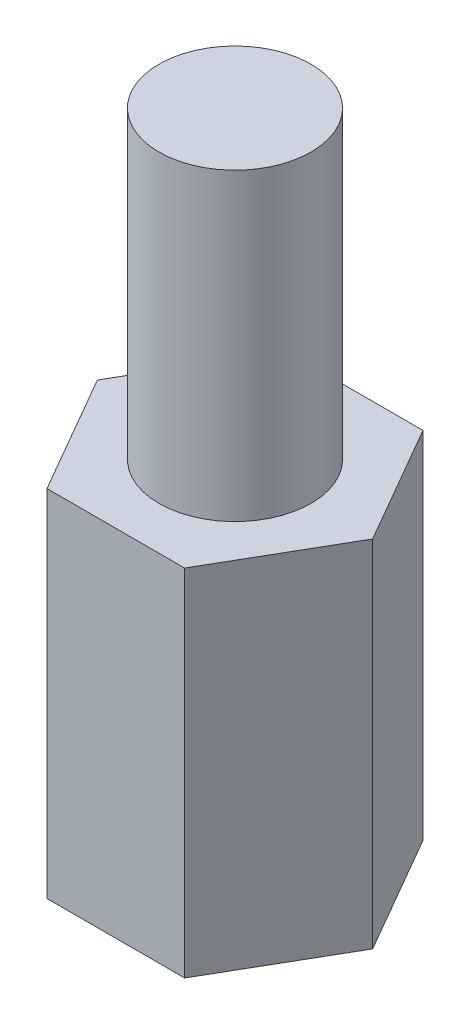
ISO-10303-21;
HEADER;
FILE_DESCRIPTION(('STEP AP214'),'2;1');
FILE_NAME('part.step','',(''),(''),'','','');
FILE_SCHEMA(('AUTOMOTIVE_DESIGN { 1 0 10303 214 1 1 1 1 }'));
ENDSEC;
DATA;
#1=APPLICATION_CONTEXT('core data for automotive mechanical design processes');
#2=APPLICATION_PROTOCOL_DEFINITION('international standard','automotive_design',2000,#1);
#3=PRODUCT_CONTEXT('',#1,'mechanical');
#4=PRODUCT('Part','Part','',(#3));
#5=PRODUCT_RELATED_PRODUCT_CATEGORY('part','',(#4));
#6=PRODUCT_DEFINITION_FORMATION('','',#4);
#7=PRODUCT_DEFINITION_CONTEXT('part definition',#1,'design');
#8=PRODUCT_DEFINITION('design','',#6,#7);
#9=PRODUCT_DEFINITION_SHAPE('','',#8);
#10=(LENGTH_UNIT() NAMED_UNIT(*) SI_UNIT(.MILLI.,.METRE.));
#11=(NAMED_UNIT(*) PLANE_ANGLE_UNIT() SI_UNIT($,.RADIAN.));
#12=(NAMED_UNIT(*) SI_UNIT($,.STERADIAN.) SOLID_ANGLE_UNIT());
#13=UNCERTAINTY_MEASURE_WITH_UNIT(LENGTH_MEASURE(1.E-05),#10,'distance_accuracy_value','');
#14=(GEOMETRIC_REPRESENTATION_CONTEXT(3) GLOBAL_UNCERTAINTY_ASSIGNED_CONTEXT((#13)) GLOBAL_UNIT_ASSIGNED_CONTEXT((#10,
#11,#12)) REPRESENTATION_CONTEXT('',''));
#15=CARTESIAN_POINT('',(0.,0.,0.));
#16=DIRECTION('',(0.,0.,1.));
#17=DIRECTION('',(1.,0.,0.));
#18=AXIS2_PLACEMENT_3D('',#15,#16,#17);
#19=CARTESIAN_POINT('',(0.,-7.,0.));
#20=DIRECTION('',(0.,1.,0.));
#21=DIRECTION('',(0.,0.,1.));
#22=AXIS2_PLACEMENT_3D('',#19,#20,#21);
#23=CYLINDRICAL_SURFACE('',#22,1.5);
#24=CARTESIAN_POINT('',(0.,-7.,0.));
#25=DIRECTION('',(0.,1.,0.));
#26=DIRECTION('',(0.,0.,1.));
#27=AXIS2_PLACEMENT_3D('',#24,#25,#26);
#28=CIRCLE('',#27,1.5);
#29=CARTESIAN_POINT('',(0.,-7.,1.5));
#30=VERTEX_POINT('',#29);
#31=EDGE_CURVE('E129',#30,#30,#28,.T.);
#32=ORIENTED_EDGE('',*,*,#31,.F.);
#33=EDGE_LOOP('',(#32));
#34=FACE_BOUND('',#33,.T.);
#35=CARTESIAN_POINT('',(0.,-1.,0.));
#36=DIRECTION('',(0.,1.,0.));
#37=DIRECTION('',(0.,0.,1.));
#38=AXIS2_PLACEMENT_3D('',#35,#36,#37);
#39=CIRCLE('',#38,1.5);
#40=CARTESIAN_POINT('',(0.,-1.,1.5));
#41=VERTEX_POINT('',#40);
#42=EDGE_CURVE('E11',#41,#41,#39,.F.);
#43=ORIENTED_EDGE('',*,*,#42,.F.);
#44=EDGE_LOOP('',(#43));
#45=FACE_BOUND('',#44,.T.);
#46=ADVANCED_FACE('F38',(#34,#45),#23,.F.);
#47=CARTESIAN_POINT('',(1.35677313259562,-7.,2.35));
#48=DIRECTION('',(0.866025403784439,0.,0.5));
#49=DIRECTION('',(0.5,0.,-0.866025403784439));
#50=AXIS2_PLACEMENT_3D('',#47,#48,#49);
#51=PLANE('',#50);
#52=DIRECTION('',(0.5,0.,-0.866025403784439));
#53=VECTOR('',#52,1.);
#54=CARTESIAN_POINT('',(1.35677313259562,0.,2.35));
#55=LINE('',#54,#53);
#56=CARTESIAN_POINT('',(1.35677313259562,0.,2.35));
#57=VERTEX_POINT('',#56);
#58=CARTESIAN_POINT('',(2.71354626519124,0.,0.));
#59=VERTEX_POINT('',#58);
#60=EDGE_CURVE('E125',#57,#59,#55,.T.);
#61=ORIENTED_EDGE('',*,*,#60,.F.);
#62=DIRECTION('',(0.,1.,0.));
#63=VECTOR('',#62,1.);
#64=CARTESIAN_POINT('',(1.35677313259562,-7.,2.35));
#65=LINE('',#64,#63);
#66=CARTESIAN_POINT('',(1.35677313259562,-7.,2.35));
#67=VERTEX_POINT('',#66);
#68=EDGE_CURVE('E47',#67,#57,#65,.T.);
#69=ORIENTED_EDGE('',*,*,#68,.F.);
#70=DIRECTION('',(0.5,0.,-0.866025403784439));
#71=VECTOR('',#70,1.);
#72=CARTESIAN_POINT('',(1.35677313259562,-7.,2.35));
#73=LINE('',#72,#71);
#74=CARTESIAN_POINT('',(2.71354626519124,-7.,0.));
#75=VERTEX_POINT('',#74);
#76=EDGE_CURVE('E141',#67,#75,#73,.T.);
#77=ORIENTED_EDGE('',*,*,#76,.T.);
#78=DIRECTION('',(0.,1.,0.));
#79=VECTOR('',#78,1.);
#80=CARTESIAN_POINT('',(2.71354626519124,-7.,0.));
#81=LINE('',#80,#79);
#82=EDGE_CURVE('E89',#75,#59,#81,.T.);
#83=ORIENTED_EDGE('',*,*,#82,.T.);
#84=EDGE_LOOP('',(#61,#69,#77,#83));
#85=FACE_BOUND('',#84,.T.);
#86=ADVANCED_FACE('F40',(#85),#51,.T.);
#87=CARTESIAN_POINT('',(-1.35677313259562,-7.,2.35));
#88=DIRECTION('',(0.,0.,1.));
#89=DIRECTION('',(1.,0.,0.));
#90=AXIS2_PLACEMENT_3D('',#87,#88,#89);
#91=PLANE('',#90);
#92=DIRECTION('',(1.,0.,0.));
#93=VECTOR('',#92,1.);
#94=CARTESIAN_POINT('',(-1.35677313259562,0.,2.35));
#95=LINE('',#94,#93);
#96=CARTESIAN_POINT('',(-1.35677313259562,0.,2.35));
#97=VERTEX_POINT('',#96);
#98=EDGE_CURVE('E138',#97,#57,#95,.T.);
#99=ORIENTED_EDGE('',*,*,#98,.F.);
#100=DIRECTION('',(0.,1.,0.));
#101=VECTOR('',#100,1.);
#102=CARTESIAN_POINT('',(-1.35677313259562,-7.,2.35));
#103=LINE('',#102,#101);
#104=CARTESIAN_POINT('',(-1.35677313259562,-7.,2.35));
#105=VERTEX_POINT('',#104);
#106=EDGE_CURVE('E77',#105,#97,#103,.T.);
#107=ORIENTED_EDGE('',*,*,#106,.F.);
#108=DIRECTION('',(1.,0.,0.));
#109=VECTOR('',#108,1.);
#110=CARTESIAN_POINT('',(-1.35677313259562,-7.,2.35));
#111=LINE('',#110,#109);
#112=EDGE_CURVE('E115',#105,#67,#111,.T.);
#113=ORIENTED_EDGE('',*,*,#112,.T.);
#114=ORIENTED_EDGE('',*,*,#68,.T.);
#115=EDGE_LOOP('',(#99,#107,#113,#114));
#116=FACE_BOUND('',#115,.T.);
#117=ADVANCED_FACE('F150',(#116),#91,.T.);
#118=CARTESIAN_POINT('',(-2.71354626519124,-7.,0.));
#119=DIRECTION('',(-0.866025403784438,0.,0.5));
#120=DIRECTION('',(0.5,0.,0.866025403784439));
#121=AXIS2_PLACEMENT_3D('',#118,#119,#120);
#122=PLANE('',#121);
#123=DIRECTION('',(0.5,0.,0.866025403784438));
#124=VECTOR('',#123,1.);
#125=CARTESIAN_POINT('',(-2.71354626519124,0.,0.));
#126=LINE('',#125,#124);
#127=CARTESIAN_POINT('',(-2.71354626519124,0.,0.));
#128=VERTEX_POINT('',#127);
#129=EDGE_CURVE('E102',#128,#97,#126,.T.);
#130=ORIENTED_EDGE('',*,*,#129,.F.);
#131=DIRECTION('',(0.,1.,0.));
#132=VECTOR('',#131,1.);
#133=CARTESIAN_POINT('',(-2.71354626519124,-7.,0.));
#134=LINE('',#133,#132);
#135=CARTESIAN_POINT('',(-2.71354626519124,-7.,0.));
#136=VERTEX_POINT('',#135);
#137=EDGE_CURVE('E97',#136,#128,#134,.T.);
#138=ORIENTED_EDGE('',*,*,#137,.F.);
#139=DIRECTION('',(0.5,0.,0.866025403784438));
#140=VECTOR('',#139,1.);
#141=CARTESIAN_POINT('',(-2.71354626519124,-7.,0.));
#142=LINE('',#141,#140);
#143=EDGE_CURVE('E100',#136,#105,#142,.T.);
#144=ORIENTED_EDGE('',*,*,#143,.T.);
#145=ORIENTED_EDGE('',*,*,#106,.T.);
#146=EDGE_LOOP('',(#130,#138,#144,#145));
#147=FACE_BOUND('',#146,.T.);
#148=ADVANCED_FACE('F99',(#147),#122,.T.);
#149=CARTESIAN_POINT('',(-1.35677313259562,-7.,-2.35));
#150=DIRECTION('',(-0.866025403784439,0.,-0.5));
#151=DIRECTION('',(-0.5,0.,0.866025403784439));
#152=AXIS2_PLACEMENT_3D('',#149,#150,#151);
#153=PLANE('',#152);
#154=DIRECTION('',(-0.5,0.,0.866025403784439));
#155=VECTOR('',#154,1.);
#156=CARTESIAN_POINT('',(-1.35677313259562,0.,-2.35));
#157=LINE('',#156,#155);
#158=CARTESIAN_POINT('',(-1.35677313259562,0.,-2.35));
#159=VERTEX_POINT('',#158);
#160=EDGE_CURVE('E135',#159,#128,#157,.T.);
#161=ORIENTED_EDGE('',*,*,#160,.F.);
#162=DIRECTION('',(0.,1.,0.));
#163=VECTOR('',#162,1.);
#164=CARTESIAN_POINT('',(-1.35677313259562,-7.,-2.35));
#165=LINE('',#164,#163);
#166=CARTESIAN_POINT('',(-1.35677313259562,-7.,-2.35));
#167=VERTEX_POINT('',#166);
#168=EDGE_CURVE('E107',#167,#159,#165,.T.);
#169=ORIENTED_EDGE('',*,*,#168,.F.);
#170=DIRECTION('',(-0.5,0.,0.866025403784439));
#171=VECTOR('',#170,1.);
#172=CARTESIAN_POINT('',(-1.35677313259562,-7.,-2.35));
#173=LINE('',#172,#171);
#174=EDGE_CURVE('E113',#167,#136,#173,.T.);
#175=ORIENTED_EDGE('',*,*,#174,.T.);
#176=ORIENTED_EDGE('',*,*,#137,.T.);
#177=EDGE_LOOP('',(#161,#169,#175,#176));
#178=FACE_BOUND('',#177,.T.);
#179=ADVANCED_FACE('F117',(#178),#153,.T.);
#180=CARTESIAN_POINT('',(1.35677313259562,-7.,-2.35));
#181=DIRECTION('',(0.,0.,-1.));
#182=DIRECTION('',(-1.,0.,0.));
#183=AXIS2_PLACEMENT_3D('',#180,#181,#182);
#184=PLANE('',#183);
#185=DIRECTION('',(-1.,0.,0.));
#186=VECTOR('',#185,1.);
#187=CARTESIAN_POINT('',(1.35677313259562,0.,-2.35));
#188=LINE('',#187,#186);
#189=CARTESIAN_POINT('',(1.35677313259562,0.,-2.35));
#190=VERTEX_POINT('',#189);
#191=EDGE_CURVE('E132',#190,#159,#188,.T.);
#192=ORIENTED_EDGE('',*,*,#191,.F.);
#193=DIRECTION('',(0.,1.,0.));
#194=VECTOR('',#193,1.);
#195=CARTESIAN_POINT('',(1.35677313259562,-7.,-2.35));
#196=LINE('',#195,#194);
#197=CARTESIAN_POINT('',(1.35677313259562,-7.,-2.35));
#198=VERTEX_POINT('',#197);
#199=EDGE_CURVE('E145',#198,#190,#196,.T.);
#200=ORIENTED_EDGE('',*,*,#199,.F.);
#201=DIRECTION('',(-1.,0.,0.));
#202=VECTOR('',#201,1.);
#203=CARTESIAN_POINT('',(1.35677313259562,-7.,-2.35));
#204=LINE('',#203,#202);
#205=EDGE_CURVE('E118',#198,#167,#204,.T.);
#206=ORIENTED_EDGE('',*,*,#205,.T.);
#207=ORIENTED_EDGE('',*,*,#168,.T.);
#208=EDGE_LOOP('',(#192,#200,#206,#207));
#209=FACE_BOUND('',#208,.T.);
#210=ADVANCED_FACE('F191',(#209),#184,.T.);
#211=CARTESIAN_POINT('',(2.71354626519124,-7.,0.));
#212=DIRECTION('',(0.866025403784438,0.,-0.5));
#213=DIRECTION('',(-0.5,0.,-0.866025403784438));
#214=AXIS2_PLACEMENT_3D('',#211,#212,#213);
#215=PLANE('',#214);
#216=DIRECTION('',(-0.5,0.,-0.866025403784438));
#217=VECTOR('',#216,1.);
#218=CARTESIAN_POINT('',(2.71354626519124,0.,0.));
#219=LINE('',#218,#217);
#220=EDGE_CURVE('E128',#59,#190,#219,.T.);
#221=ORIENTED_EDGE('',*,*,#220,.F.);
#222=ORIENTED_EDGE('',*,*,#82,.F.);
#223=DIRECTION('',(-0.5,0.,-0.866025403784438));
#224=VECTOR('',#223,1.);
#225=CARTESIAN_POINT('',(2.71354626519124,-7.,0.));
#226=LINE('',#225,#224);
#227=EDGE_CURVE('E120',#75,#198,#226,.T.);
#228=ORIENTED_EDGE('',*,*,#227,.T.);
#229=ORIENTED_EDGE('',*,*,#199,.T.);
#230=EDGE_LOOP('',(#221,#222,#228,#229));
#231=FACE_BOUND('',#230,.T.);
#232=ADVANCED_FACE('F146',(#231),#215,.T.);
#233=CARTESIAN_POINT('',(0.,-7.,0.));
#234=DIRECTION('',(0.,1.,0.));
#235=DIRECTION('',(0.,0.,1.));
#236=AXIS2_PLACEMENT_3D('',#233,#234,#235);
#237=PLANE('',#236);
#238=ORIENTED_EDGE('',*,*,#31,.T.);
#239=EDGE_LOOP('',(#238));
#240=FACE_BOUND('',#239,.T.);
#241=ORIENTED_EDGE('',*,*,#76,.F.);
#242=ORIENTED_EDGE('',*,*,#112,.F.);
#243=ORIENTED_EDGE('',*,*,#143,.F.);
#244=ORIENTED_EDGE('',*,*,#174,.F.);
#245=ORIENTED_EDGE('',*,*,#205,.F.);
#246=ORIENTED_EDGE('',*,*,#227,.F.);
#247=EDGE_LOOP('',(#241,#242,#243,#244,#245,#246));
#248=FACE_BOUND('',#247,.T.);
#249=ADVANCED_FACE('F111',(#240,#248),#237,.F.);
#250=CARTESIAN_POINT('',(0.,0.,0.));
#251=DIRECTION('',(0.,1.,0.));
#252=DIRECTION('',(0.,0.,1.));
#253=AXIS2_PLACEMENT_3D('',#250,#251,#252);
#254=PLANE('',#253);
#255=CARTESIAN_POINT('',(0.,0.,0.));
#256=DIRECTION('',(0.,1.,0.));
#257=DIRECTION('',(0.,0.,1.));
#258=AXIS2_PLACEMENT_3D('',#255,#256,#257);
#259=CIRCLE('',#258,1.5);
#260=CARTESIAN_POINT('',(0.,0.,1.5));
#261=VERTEX_POINT('',#260);
#262=EDGE_CURVE('E181',#261,#261,#259,.T.);
#263=ORIENTED_EDGE('',*,*,#262,.F.);
#264=EDGE_LOOP('',(#263));
#265=FACE_BOUND('',#264,.T.);
#266=ORIENTED_EDGE('',*,*,#60,.T.);
#267=ORIENTED_EDGE('',*,*,#220,.T.);
#268=ORIENTED_EDGE('',*,*,#191,.T.);
#269=ORIENTED_EDGE('',*,*,#160,.T.);
#270=ORIENTED_EDGE('',*,*,#129,.T.);
#271=ORIENTED_EDGE('',*,*,#98,.T.);
#272=EDGE_LOOP('',(#266,#267,#268,#269,#270,#271));
#273=FACE_BOUND('',#272,.T.);
#274=ADVANCED_FACE('F149',(#265,#273),#254,.T.);
#275=CARTESIAN_POINT('',(0.,-1.,0.));
#276=DIRECTION('',(0.,1.,0.));
#277=DIRECTION('',(0.,0.,1.));
#278=AXIS2_PLACEMENT_3D('',#275,#276,#277);
#279=PLANE('',#278);
#280=ORIENTED_EDGE('',*,*,#42,.T.);
#281=EDGE_LOOP('',(#280));
#282=FACE_BOUND('',#281,.T.);
#283=ADVANCED_FACE('F173',(#282),#279,.F.);
#284=CARTESIAN_POINT('',(0.,-1.,0.));
#285=DIRECTION('',(0.,1.,0.));
#286=DIRECTION('',(0.,0.,1.));
#287=AXIS2_PLACEMENT_3D('',#284,#285,#286);
#288=CYLINDRICAL_SURFACE('',#287,1.5);
#289=ORIENTED_EDGE('',*,*,#262,.T.);
#290=EDGE_LOOP('',(#289));
#291=FACE_BOUND('',#290,.T.);
#292=CARTESIAN_POINT('',(0.,6.,0.));
#293=DIRECTION('',(0.,1.,0.));
#294=DIRECTION('',(0.,0.,1.));
#295=AXIS2_PLACEMENT_3D('',#292,#293,#294);
#296=CIRCLE('',#295,1.5);
#297=CARTESIAN_POINT('',(0.,6.,1.5));
#298=VERTEX_POINT('',#297);
#299=EDGE_CURVE('E183',#298,#298,#296,.T.);
#300=ORIENTED_EDGE('',*,*,#299,.F.);
#301=EDGE_LOOP('',(#300));
#302=FACE_BOUND('',#301,.T.);
#303=ADVANCED_FACE('F168',(#291,#302),#288,.T.);
#304=CARTESIAN_POINT('',(0.,6.,0.));
#305=DIRECTION('',(0.,1.,0.));
#306=DIRECTION('',(0.,0.,1.));
#307=AXIS2_PLACEMENT_3D('',#304,#305,#306);
#308=PLANE('',#307);
#309=ORIENTED_EDGE('',*,*,#299,.T.);
#310=EDGE_LOOP('',(#309));
#311=FACE_BOUND('',#310,.T.);
#312=ADVANCED_FACE('F255',(#311),#308,.T.);
#313=CLOSED_SHELL('',(#46,#86,#117,#148,#179,#210,#232,#249,#274,#283,#303,#312));
#314=MANIFOLD_SOLID_BREP('B2',#313);
#315=ADVANCED_BREP_SHAPE_REPRESENTATION('',(#18,#314),#14);
#316=SHAPE_DEFINITION_REPRESENTATION(#9,#315);
ENDSEC;
END-ISO-10303-21;
